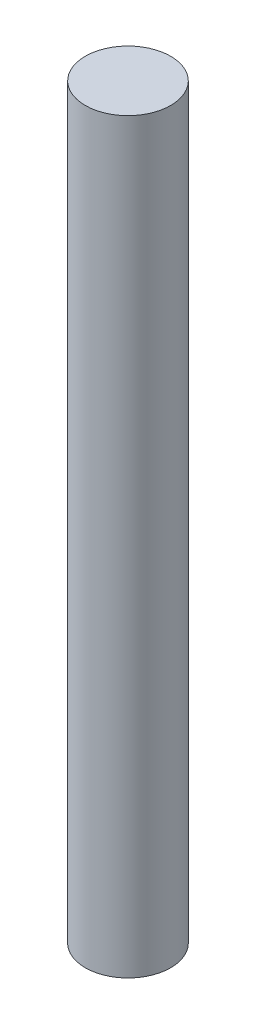
ISO-10303-21;
HEADER;
FILE_DESCRIPTION(('STEP AP214'),'2;1');
FILE_NAME('part.step','',(''),(''),'','','');
FILE_SCHEMA(('AUTOMOTIVE_DESIGN { 1 0 10303 214 1 1 1 1 }'));
ENDSEC;
DATA;
#1=APPLICATION_CONTEXT('core data for automotive mechanical design processes');
#2=APPLICATION_PROTOCOL_DEFINITION('international standard','automotive_design',2000,#1);
#3=PRODUCT_CONTEXT('',#1,'mechanical');
#4=PRODUCT('Part','Part','',(#3));
#5=PRODUCT_RELATED_PRODUCT_CATEGORY('part','',(#4));
#6=PRODUCT_DEFINITION_FORMATION('','',#4);
#7=PRODUCT_DEFINITION_CONTEXT('part definition',#1,'design');
#8=PRODUCT_DEFINITION('design','',#6,#7);
#9=PRODUCT_DEFINITION_SHAPE('','',#8);
#10=(LENGTH_UNIT() NAMED_UNIT(*) SI_UNIT(.MILLI.,.METRE.));
#11=(NAMED_UNIT(*) PLANE_ANGLE_UNIT() SI_UNIT($,.RADIAN.));
#12=(NAMED_UNIT(*) SI_UNIT($,.STERADIAN.) SOLID_ANGLE_UNIT());
#13=UNCERTAINTY_MEASURE_WITH_UNIT(LENGTH_MEASURE(1.E-05),#10,'distance_accuracy_value','');
#14=(GEOMETRIC_REPRESENTATION_CONTEXT(3) GLOBAL_UNCERTAINTY_ASSIGNED_CONTEXT((#13)) GLOBAL_UNIT_ASSIGNED_CONTEXT((#10,
#11,#12)) REPRESENTATION_CONTEXT('',''));
#15=CARTESIAN_POINT('',(0.,0.,0.));
#16=DIRECTION('',(0.,0.,1.));
#17=DIRECTION('',(1.,0.,0.));
#18=AXIS2_PLACEMENT_3D('',#15,#16,#17);
#19=CARTESIAN_POINT('',(0.,70.,0.));
#20=DIRECTION('',(0.,-1.,0.));
#21=DIRECTION('',(0.,0.,-1.));
#22=AXIS2_PLACEMENT_3D('',#19,#20,#21);
#23=CYLINDRICAL_SURFACE('',#22,4.);
#24=CARTESIAN_POINT('',(0.,70.,0.));
#25=DIRECTION('',(0.,1.,0.));
#26=DIRECTION('',(0.,0.,1.));
#27=AXIS2_PLACEMENT_3D('',#24,#25,#26);
#28=CIRCLE('',#27,4.);
#29=CARTESIAN_POINT('',(0.,70.,4.));
#30=VERTEX_POINT('',#29);
#31=EDGE_CURVE('E10',#30,#30,#28,.T.);
#32=ORIENTED_EDGE('',*,*,#31,.F.);
#33=EDGE_LOOP('',(#32));
#34=FACE_BOUND('',#33,.T.);
#35=CARTESIAN_POINT('',(0.,0.,0.));
#36=DIRECTION('',(0.,1.,0.));
#37=DIRECTION('',(0.,0.,1.));
#38=AXIS2_PLACEMENT_3D('',#35,#36,#37);
#39=CIRCLE('',#38,4.);
#40=CARTESIAN_POINT('',(0.,0.,4.));
#41=VERTEX_POINT('',#40);
#42=EDGE_CURVE('E37',#41,#41,#39,.T.);
#43=ORIENTED_EDGE('',*,*,#42,.T.);
#44=EDGE_LOOP('',(#43));
#45=FACE_BOUND('',#44,.T.);
#46=ADVANCED_FACE('F34',(#34,#45),#23,.T.);
#47=CARTESIAN_POINT('',(0.,70.,0.));
#48=DIRECTION('',(0.,1.,0.));
#49=DIRECTION('',(0.,0.,1.));
#50=AXIS2_PLACEMENT_3D('',#47,#48,#49);
#51=PLANE('',#50);
#52=ORIENTED_EDGE('',*,*,#31,.T.);
#53=EDGE_LOOP('',(#52));
#54=FACE_BOUND('',#53,.T.);
#55=ADVANCED_FACE('F49',(#54),#51,.T.);
#56=CARTESIAN_POINT('',(0.,0.,0.));
#57=DIRECTION('',(0.,1.,0.));
#58=DIRECTION('',(0.,0.,1.));
#59=AXIS2_PLACEMENT_3D('',#56,#57,#58);
#60=PLANE('',#59);
#61=ORIENTED_EDGE('',*,*,#42,.F.);
#62=EDGE_LOOP('',(#61));
#63=FACE_BOUND('',#62,.T.);
#64=ADVANCED_FACE('F47',(#63),#60,.F.);
#65=CLOSED_SHELL('',(#46,#55,#64));
#66=MANIFOLD_SOLID_BREP('B2',#65);
#67=ADVANCED_BREP_SHAPE_REPRESENTATION('',(#18,#66),#14);
#68=SHAPE_DEFINITION_REPRESENTATION(#9,#67);
ENDSEC;
END-ISO-10303-21;
